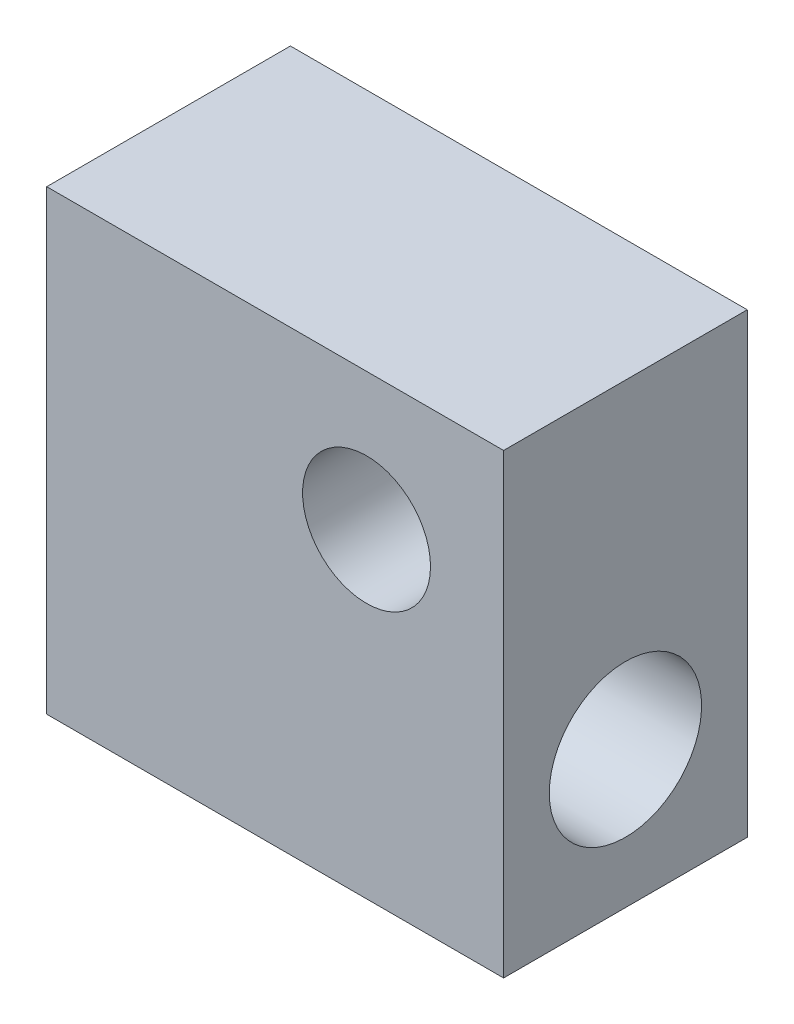
ISO-10303-21;
HEADER;
FILE_DESCRIPTION(('STEP AP214'),'2;1');
FILE_NAME('part.step','',(''),(''),'','','');
FILE_SCHEMA(('AUTOMOTIVE_DESIGN { 1 0 10303 214 1 1 1 1 }'));
ENDSEC;
DATA;
#1=APPLICATION_CONTEXT('core data for automotive mechanical design processes');
#2=APPLICATION_PROTOCOL_DEFINITION('international standard','automotive_design',2000,#1);
#3=PRODUCT_CONTEXT('',#1,'mechanical');
#4=PRODUCT('Part','Part','',(#3));
#5=PRODUCT_RELATED_PRODUCT_CATEGORY('part','',(#4));
#6=PRODUCT_DEFINITION_FORMATION('','',#4);
#7=PRODUCT_DEFINITION_CONTEXT('part definition',#1,'design');
#8=PRODUCT_DEFINITION('design','',#6,#7);
#9=PRODUCT_DEFINITION_SHAPE('','',#8);
#10=(LENGTH_UNIT() NAMED_UNIT(*) SI_UNIT(.MILLI.,.METRE.));
#11=(NAMED_UNIT(*) PLANE_ANGLE_UNIT() SI_UNIT($,.RADIAN.));
#12=(NAMED_UNIT(*) SI_UNIT($,.STERADIAN.) SOLID_ANGLE_UNIT());
#13=UNCERTAINTY_MEASURE_WITH_UNIT(LENGTH_MEASURE(1.E-05),#10,'distance_accuracy_value','');
#14=(GEOMETRIC_REPRESENTATION_CONTEXT(3) GLOBAL_UNCERTAINTY_ASSIGNED_CONTEXT((#13)) GLOBAL_UNIT_ASSIGNED_CONTEXT((#10,
#11,#12)) REPRESENTATION_CONTEXT('',''));
#15=CARTESIAN_POINT('',(0.,0.,0.));
#16=DIRECTION('',(0.,0.,1.));
#17=DIRECTION('',(1.,0.,0.));
#18=AXIS2_PLACEMENT_3D('',#15,#16,#17);
#19=CARTESIAN_POINT('',(0.,0.,8.));
#20=DIRECTION('',(1.,0.,0.));
#21=DIRECTION('',(0.,0.,-1.));
#22=AXIS2_PLACEMENT_3D('',#19,#20,#21);
#23=PLANE('',#22);
#24=CARTESIAN_POINT('',(0.,4.5,4.));
#25=DIRECTION('',(-1.,0.,0.));
#26=DIRECTION('',(0.,0.,1.));
#27=AXIS2_PLACEMENT_3D('',#24,#25,#26);
#28=CIRCLE('',#27,2.49999999999999);
#29=CARTESIAN_POINT('',(0.,4.5,6.49999999999999));
#30=VERTEX_POINT('',#29);
#31=EDGE_CURVE('E116',#30,#30,#28,.T.);
#32=ORIENTED_EDGE('',*,*,#31,.F.);
#33=EDGE_LOOP('',(#32));
#34=FACE_BOUND('',#33,.T.);
#35=DIRECTION('',(0.,-1.,0.));
#36=VECTOR('',#35,1.);
#37=CARTESIAN_POINT('',(0.,0.,0.));
#38=LINE('',#37,#36);
#39=CARTESIAN_POINT('',(0.,15.,0.));
#40=VERTEX_POINT('',#39);
#41=CARTESIAN_POINT('',(0.,0.,0.));
#42=VERTEX_POINT('',#41);
#43=EDGE_CURVE('E94',#40,#42,#38,.T.);
#44=ORIENTED_EDGE('',*,*,#43,.T.);
#45=DIRECTION('',(0.,0.,-1.));
#46=VECTOR('',#45,1.);
#47=CARTESIAN_POINT('',(0.,0.,8.));
#48=LINE('',#47,#46);
#49=CARTESIAN_POINT('',(0.,0.,8.));
#50=VERTEX_POINT('',#49);
#51=EDGE_CURVE('E11',#50,#42,#48,.T.);
#52=ORIENTED_EDGE('',*,*,#51,.F.);
#53=DIRECTION('',(0.,-1.,0.));
#54=VECTOR('',#53,1.);
#55=CARTESIAN_POINT('',(0.,0.,8.));
#56=LINE('',#55,#54);
#57=CARTESIAN_POINT('',(0.,15.,8.));
#58=VERTEX_POINT('',#57);
#59=EDGE_CURVE('E82',#58,#50,#56,.T.);
#60=ORIENTED_EDGE('',*,*,#59,.F.);
#61=DIRECTION('',(0.,0.,-1.));
#62=VECTOR('',#61,1.);
#63=CARTESIAN_POINT('',(0.,15.,8.));
#64=LINE('',#63,#62);
#65=EDGE_CURVE('E90',#58,#40,#64,.T.);
#66=ORIENTED_EDGE('',*,*,#65,.T.);
#67=EDGE_LOOP('',(#44,#52,#60,#66));
#68=FACE_BOUND('',#67,.T.);
#69=ADVANCED_FACE('F31',(#34,#68),#23,.F.);
#70=CARTESIAN_POINT('',(0.,0.,8.));
#71=DIRECTION('',(0.,1.,0.));
#72=DIRECTION('',(0.,0.,1.));
#73=AXIS2_PLACEMENT_3D('',#70,#71,#72);
#74=PLANE('',#73);
#75=DIRECTION('',(1.,0.,0.));
#76=VECTOR('',#75,1.);
#77=CARTESIAN_POINT('',(0.,0.,0.));
#78=LINE('',#77,#76);
#79=CARTESIAN_POINT('',(15.,0.,0.));
#80=VERTEX_POINT('',#79);
#81=EDGE_CURVE('E86',#42,#80,#78,.T.);
#82=ORIENTED_EDGE('',*,*,#81,.T.);
#83=DIRECTION('',(0.,0.,-1.));
#84=VECTOR('',#83,1.);
#85=CARTESIAN_POINT('',(15.,0.,8.));
#86=LINE('',#85,#84);
#87=CARTESIAN_POINT('',(15.,0.,8.));
#88=VERTEX_POINT('',#87);
#89=EDGE_CURVE('E39',#88,#80,#86,.T.);
#90=ORIENTED_EDGE('',*,*,#89,.F.);
#91=DIRECTION('',(1.,0.,0.));
#92=VECTOR('',#91,1.);
#93=CARTESIAN_POINT('',(0.,0.,8.));
#94=LINE('',#93,#92);
#95=EDGE_CURVE('E77',#50,#88,#94,.T.);
#96=ORIENTED_EDGE('',*,*,#95,.F.);
#97=ORIENTED_EDGE('',*,*,#51,.T.);
#98=EDGE_LOOP('',(#82,#90,#96,#97));
#99=FACE_BOUND('',#98,.T.);
#100=ADVANCED_FACE('F85',(#99),#74,.F.);
#101=CARTESIAN_POINT('',(15.,0.,8.));
#102=DIRECTION('',(-1.,0.,0.));
#103=DIRECTION('',(0.,0.,1.));
#104=AXIS2_PLACEMENT_3D('',#101,#102,#103);
#105=PLANE('',#104);
#106=CARTESIAN_POINT('',(15.,4.5,4.));
#107=DIRECTION('',(-1.,0.,0.));
#108=DIRECTION('',(0.,0.,1.));
#109=AXIS2_PLACEMENT_3D('',#106,#107,#108);
#110=CIRCLE('',#109,2.5);
#111=CARTESIAN_POINT('',(15.,4.5,6.5));
#112=VERTEX_POINT('',#111);
#113=EDGE_CURVE('E113',#112,#112,#110,.T.);
#114=ORIENTED_EDGE('',*,*,#113,.T.);
#115=EDGE_LOOP('',(#114));
#116=FACE_BOUND('',#115,.T.);
#117=DIRECTION('',(0.,1.,0.));
#118=VECTOR('',#117,1.);
#119=CARTESIAN_POINT('',(15.,0.,0.));
#120=LINE('',#119,#118);
#121=CARTESIAN_POINT('',(15.,15.,0.));
#122=VERTEX_POINT('',#121);
#123=EDGE_CURVE('E64',#80,#122,#120,.T.);
#124=ORIENTED_EDGE('',*,*,#123,.T.);
#125=DIRECTION('',(0.,0.,-1.));
#126=VECTOR('',#125,1.);
#127=CARTESIAN_POINT('',(15.,15.,8.));
#128=LINE('',#127,#126);
#129=CARTESIAN_POINT('',(15.,15.,8.));
#130=VERTEX_POINT('',#129);
#131=EDGE_CURVE('E87',#130,#122,#128,.T.);
#132=ORIENTED_EDGE('',*,*,#131,.F.);
#133=DIRECTION('',(0.,1.,0.));
#134=VECTOR('',#133,1.);
#135=CARTESIAN_POINT('',(15.,0.,8.));
#136=LINE('',#135,#134);
#137=EDGE_CURVE('E80',#88,#130,#136,.T.);
#138=ORIENTED_EDGE('',*,*,#137,.F.);
#139=ORIENTED_EDGE('',*,*,#89,.T.);
#140=EDGE_LOOP('',(#124,#132,#138,#139));
#141=FACE_BOUND('',#140,.T.);
#142=ADVANCED_FACE('F88',(#116,#141),#105,.F.);
#143=CARTESIAN_POINT('',(0.,15.,8.));
#144=DIRECTION('',(0.,-1.,0.));
#145=DIRECTION('',(0.,0.,-1.));
#146=AXIS2_PLACEMENT_3D('',#143,#144,#145);
#147=PLANE('',#146);
#148=DIRECTION('',(-1.,0.,0.));
#149=VECTOR('',#148,1.);
#150=CARTESIAN_POINT('',(0.,15.,0.));
#151=LINE('',#150,#149);
#152=EDGE_CURVE('E70',#122,#40,#151,.T.);
#153=ORIENTED_EDGE('',*,*,#152,.T.);
#154=ORIENTED_EDGE('',*,*,#65,.F.);
#155=DIRECTION('',(-1.,0.,0.));
#156=VECTOR('',#155,1.);
#157=CARTESIAN_POINT('',(0.,15.,8.));
#158=LINE('',#157,#156);
#159=EDGE_CURVE('E47',#130,#58,#158,.T.);
#160=ORIENTED_EDGE('',*,*,#159,.F.);
#161=ORIENTED_EDGE('',*,*,#131,.T.);
#162=EDGE_LOOP('',(#153,#154,#160,#161));
#163=FACE_BOUND('',#162,.T.);
#164=ADVANCED_FACE('F102',(#163),#147,.F.);
#165=CARTESIAN_POINT('',(0.,15.,8.));
#166=DIRECTION('',(0.,0.,-1.));
#167=DIRECTION('',(-1.,0.,0.));
#168=AXIS2_PLACEMENT_3D('',#165,#166,#167);
#169=PLANE('',#168);
#170=CARTESIAN_POINT('',(10.5,10.5,8.));
#171=DIRECTION('',(0.,0.,1.));
#172=DIRECTION('',(1.,0.,0.));
#173=AXIS2_PLACEMENT_3D('',#170,#171,#172);
#174=CIRCLE('',#173,2.09999999999999);
#175=CARTESIAN_POINT('',(12.6,10.5,8.));
#176=VERTEX_POINT('',#175);
#177=EDGE_CURVE('E110',#176,#176,#174,.T.);
#178=ORIENTED_EDGE('',*,*,#177,.F.);
#179=EDGE_LOOP('',(#178));
#180=FACE_BOUND('',#179,.T.);
#181=ORIENTED_EDGE('',*,*,#59,.T.);
#182=ORIENTED_EDGE('',*,*,#95,.T.);
#183=ORIENTED_EDGE('',*,*,#137,.T.);
#184=ORIENTED_EDGE('',*,*,#159,.T.);
#185=EDGE_LOOP('',(#181,#182,#183,#184));
#186=FACE_BOUND('',#185,.T.);
#187=ADVANCED_FACE('F78',(#180,#186),#169,.F.);
#188=CARTESIAN_POINT('',(0.,15.,0.));
#189=DIRECTION('',(0.,0.,-1.));
#190=DIRECTION('',(-1.,0.,0.));
#191=AXIS2_PLACEMENT_3D('',#188,#189,#190);
#192=PLANE('',#191);
#193=CARTESIAN_POINT('',(10.5,10.5,0.));
#194=DIRECTION('',(0.,0.,1.));
#195=DIRECTION('',(1.,0.,0.));
#196=AXIS2_PLACEMENT_3D('',#193,#194,#195);
#197=CIRCLE('',#196,2.1);
#198=CARTESIAN_POINT('',(12.6,10.5,0.));
#199=VERTEX_POINT('',#198);
#200=EDGE_CURVE('E97',#199,#199,#197,.T.);
#201=ORIENTED_EDGE('',*,*,#200,.T.);
#202=EDGE_LOOP('',(#201));
#203=FACE_BOUND('',#202,.T.);
#204=ORIENTED_EDGE('',*,*,#43,.F.);
#205=ORIENTED_EDGE('',*,*,#152,.F.);
#206=ORIENTED_EDGE('',*,*,#123,.F.);
#207=ORIENTED_EDGE('',*,*,#81,.F.);
#208=EDGE_LOOP('',(#204,#205,#206,#207));
#209=FACE_BOUND('',#208,.T.);
#210=ADVANCED_FACE('F105',(#203,#209),#192,.T.);
#211=CARTESIAN_POINT('',(10.5,10.5,8.));
#212=DIRECTION('',(0.,0.,1.));
#213=DIRECTION('',(1.,0.,0.));
#214=AXIS2_PLACEMENT_3D('',#211,#212,#213);
#215=CYLINDRICAL_SURFACE('',#214,2.09999999999999);
#216=ORIENTED_EDGE('',*,*,#200,.F.);
#217=EDGE_LOOP('',(#216));
#218=FACE_BOUND('',#217,.T.);
#219=ORIENTED_EDGE('',*,*,#177,.T.);
#220=EDGE_LOOP('',(#219));
#221=FACE_BOUND('',#220,.T.);
#222=ADVANCED_FACE('F136',(#218,#221),#215,.F.);
#223=CARTESIAN_POINT('',(0.,4.5,4.));
#224=DIRECTION('',(-1.,0.,0.));
#225=DIRECTION('',(0.,0.,1.));
#226=AXIS2_PLACEMENT_3D('',#223,#224,#225);
#227=CYLINDRICAL_SURFACE('',#226,2.49999999999999);
#228=ORIENTED_EDGE('',*,*,#113,.F.);
#229=EDGE_LOOP('',(#228));
#230=FACE_BOUND('',#229,.T.);
#231=ORIENTED_EDGE('',*,*,#31,.T.);
#232=EDGE_LOOP('',(#231));
#233=FACE_BOUND('',#232,.T.);
#234=ADVANCED_FACE('F120',(#230,#233),#227,.F.);
#235=CLOSED_SHELL('',(#69,#100,#142,#164,#187,#210,#222,#234));
#236=MANIFOLD_SOLID_BREP('B2',#235);
#237=ADVANCED_BREP_SHAPE_REPRESENTATION('',(#18,#236),#14);
#238=SHAPE_DEFINITION_REPRESENTATION(#9,#237);
ENDSEC;
END-ISO-10303-21;
